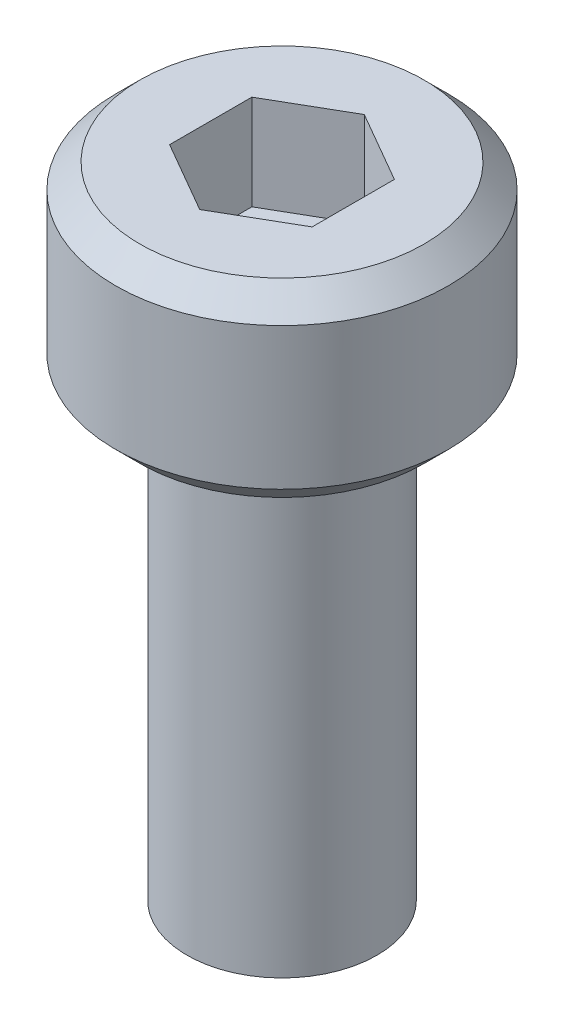
ISO-10303-21;
HEADER;
FILE_DESCRIPTION(('STEP AP214'),'2;1');
FILE_NAME('part.step','',(''),(''),'','','');
FILE_SCHEMA(('AUTOMOTIVE_DESIGN { 1 0 10303 214 1 1 1 1 }'));
ENDSEC;
DATA;
#1=APPLICATION_CONTEXT('core data for automotive mechanical design processes');
#2=APPLICATION_PROTOCOL_DEFINITION('international standard','automotive_design',2000,#1);
#3=PRODUCT_CONTEXT('',#1,'mechanical');
#4=PRODUCT('Part','Part','',(#3));
#5=PRODUCT_RELATED_PRODUCT_CATEGORY('part','',(#4));
#6=PRODUCT_DEFINITION_FORMATION('','',#4);
#7=PRODUCT_DEFINITION_CONTEXT('part definition',#1,'design');
#8=PRODUCT_DEFINITION('design','',#6,#7);
#9=PRODUCT_DEFINITION_SHAPE('','',#8);
#10=(LENGTH_UNIT() NAMED_UNIT(*) SI_UNIT(.MILLI.,.METRE.));
#11=(NAMED_UNIT(*) PLANE_ANGLE_UNIT() SI_UNIT($,.RADIAN.));
#12=(NAMED_UNIT(*) SI_UNIT($,.STERADIAN.) SOLID_ANGLE_UNIT());
#13=UNCERTAINTY_MEASURE_WITH_UNIT(LENGTH_MEASURE(1.E-05),#10,'distance_accuracy_value','');
#14=(GEOMETRIC_REPRESENTATION_CONTEXT(3) GLOBAL_UNCERTAINTY_ASSIGNED_CONTEXT((#13)) GLOBAL_UNIT_ASSIGNED_CONTEXT((#10,
#11,#12)) REPRESENTATION_CONTEXT('',''));
#15=CARTESIAN_POINT('',(0.,0.,0.));
#16=DIRECTION('',(0.,0.,1.));
#17=DIRECTION('',(1.,0.,0.));
#18=AXIS2_PLACEMENT_3D('',#15,#16,#17);
#19=CARTESIAN_POINT('',(0.,3.99999199999999,0.));
#20=DIRECTION('',(0.,-1.,0.));
#21=DIRECTION('',(1.,0.,0.));
#22=AXIS2_PLACEMENT_3D('',#19,#20,#21);
#23=CYLINDRICAL_SURFACE('',#22,3.5);
#24=CARTESIAN_POINT('',(0.,3.49199200006044,0.));
#25=DIRECTION('',(0.,1.,0.));
#26=DIRECTION('',(-1.,0.,0.));
#27=AXIS2_PLACEMENT_3D('',#24,#25,#26);
#28=CIRCLE('',#27,3.5);
#29=CARTESIAN_POINT('',(-3.5,3.49199200006044,0.));
#30=VERTEX_POINT('',#29);
#31=EDGE_CURVE('E154',#30,#30,#28,.F.);
#32=ORIENTED_EDGE('',*,*,#31,.T.);
#33=EDGE_LOOP('',(#32));
#34=FACE_BOUND('',#33,.T.);
#35=CARTESIAN_POINT('',(0.,0.507999999996399,0.));
#36=DIRECTION('',(0.,-1.,0.));
#37=DIRECTION('',(1.,0.,0.));
#38=AXIS2_PLACEMENT_3D('',#35,#36,#37);
#39=CIRCLE('',#38,3.5);
#40=CARTESIAN_POINT('',(3.5,0.507999999996399,0.));
#41=VERTEX_POINT('',#40);
#42=EDGE_CURVE('E151',#41,#41,#39,.F.);
#43=ORIENTED_EDGE('',*,*,#42,.T.);
#44=EDGE_LOOP('',(#43));
#45=FACE_BOUND('',#44,.T.);
#46=ADVANCED_FACE('F40',(#34,#45),#23,.T.);
#47=CARTESIAN_POINT('',(3.5,3.99999199999999,0.));
#48=DIRECTION('',(0.,1.,0.));
#49=DIRECTION('',(-1.,0.,0.));
#50=AXIS2_PLACEMENT_3D('',#47,#48,#49);
#51=PLANE('',#50);
#52=CARTESIAN_POINT('',(0.,3.99999199999999,0.));
#53=DIRECTION('',(0.,1.,0.));
#54=DIRECTION('',(-1.,0.,0.));
#55=AXIS2_PLACEMENT_3D('',#52,#53,#54);
#56=CIRCLE('',#55,2.9920000000036);
#57=CARTESIAN_POINT('',(-2.9920000000036,3.99999199999999,0.));
#58=VERTEX_POINT('',#57);
#59=EDGE_CURVE('E157',#58,#58,#56,.T.);
#60=ORIENTED_EDGE('',*,*,#59,.T.);
#61=EDGE_LOOP('',(#60));
#62=FACE_BOUND('',#61,.T.);
#63=DIRECTION('',(0.,0.,-1.));
#64=VECTOR('',#63,1.);
#65=CARTESIAN_POINT('',(1.5,3.99999199999999,0.866025403784437));
#66=LINE('',#65,#64);
#67=CARTESIAN_POINT('',(1.5,3.99999199999999,0.866025403784437));
#68=VERTEX_POINT('',#67);
#69=CARTESIAN_POINT('',(1.5,3.99999199999999,-0.866025403784425));
#70=VERTEX_POINT('',#69);
#71=EDGE_CURVE('E56',#68,#70,#66,.T.);
#72=ORIENTED_EDGE('',*,*,#71,.F.);
#73=DIRECTION('',(0.866025403784439,0.,-0.5));
#74=VECTOR('',#73,1.);
#75=CARTESIAN_POINT('',(0.,3.99999199999999,1.73205080756888));
#76=LINE('',#75,#74);
#77=CARTESIAN_POINT('',(0.,3.99999199999999,1.73205080756888));
#78=VERTEX_POINT('',#77);
#79=EDGE_CURVE('E139',#78,#68,#76,.T.);
#80=ORIENTED_EDGE('',*,*,#79,.F.);
#81=DIRECTION('',(0.866025403784439,0.,0.499999999999999));
#82=VECTOR('',#81,1.);
#83=CARTESIAN_POINT('',(-1.49999999999999,3.99999199999999,0.866025403784443));
#84=LINE('',#83,#82);
#85=CARTESIAN_POINT('',(-1.49999999999999,3.99999199999999,0.866025403784443));
#86=VERTEX_POINT('',#85);
#87=EDGE_CURVE('E137',#86,#78,#84,.T.);
#88=ORIENTED_EDGE('',*,*,#87,.F.);
#89=DIRECTION('',(0.,0.,1.));
#90=VECTOR('',#89,1.);
#91=CARTESIAN_POINT('',(-1.49999999999999,3.99999199999999,-0.866025403784429));
#92=LINE('',#91,#90);
#93=CARTESIAN_POINT('',(-1.49999999999999,3.99999199999999,-0.866025403784429));
#94=VERTEX_POINT('',#93);
#95=EDGE_CURVE('E104',#94,#86,#92,.T.);
#96=ORIENTED_EDGE('',*,*,#95,.F.);
#97=DIRECTION('',(-0.866025403784439,0.,0.499999999999999));
#98=VECTOR('',#97,1.);
#99=CARTESIAN_POINT('',(0.,3.99999199999999,-1.73205080756887));
#100=LINE('',#99,#98);
#101=CARTESIAN_POINT('',(0.,3.99999199999999,-1.73205080756887));
#102=VERTEX_POINT('',#101);
#103=EDGE_CURVE('E133',#102,#94,#100,.T.);
#104=ORIENTED_EDGE('',*,*,#103,.F.);
#105=DIRECTION('',(-0.866025403784437,0.,-0.500000000000003));
#106=VECTOR('',#105,1.);
#107=CARTESIAN_POINT('',(1.5,3.99999199999999,-0.866025403784425));
#108=LINE('',#107,#106);
#109=EDGE_CURVE('E130',#70,#102,#108,.T.);
#110=ORIENTED_EDGE('',*,*,#109,.F.);
#111=EDGE_LOOP('',(#72,#80,#88,#96,#104,#110));
#112=FACE_BOUND('',#111,.T.);
#113=ADVANCED_FACE('F177',(#62,#112),#51,.T.);
#114=CARTESIAN_POINT('',(0.,0.,0.));
#115=DIRECTION('',(0.,-1.,0.));
#116=DIRECTION('',(1.,0.,0.));
#117=AXIS2_PLACEMENT_3D('',#114,#115,#116);
#118=PLANE('',#117);
#119=CARTESIAN_POINT('',(0.,0.,0.));
#120=DIRECTION('',(0.,-1.,0.));
#121=DIRECTION('',(1.,0.,0.));
#122=AXIS2_PLACEMENT_3D('',#119,#120,#121);
#123=CIRCLE('',#122,2.99200000006045);
#124=CARTESIAN_POINT('',(2.99200000006045,0.,0.));
#125=VERTEX_POINT('',#124);
#126=EDGE_CURVE('E160',#125,#125,#123,.T.);
#127=ORIENTED_EDGE('',*,*,#126,.T.);
#128=EDGE_LOOP('',(#127));
#129=FACE_BOUND('',#128,.T.);
#130=CARTESIAN_POINT('',(0.,0.,0.));
#131=DIRECTION('',(0.,-1.,0.));
#132=DIRECTION('',(1.,0.,0.));
#133=AXIS2_PLACEMENT_3D('',#130,#131,#132);
#134=CIRCLE('',#133,2.);
#135=CARTESIAN_POINT('',(2.00000000000001,0.,0.));
#136=VERTEX_POINT('',#135);
#137=EDGE_CURVE('E143',#136,#136,#134,.T.);
#138=ORIENTED_EDGE('',*,*,#137,.F.);
#139=EDGE_LOOP('',(#138));
#140=FACE_BOUND('',#139,.T.);
#141=ADVANCED_FACE('F183',(#129,#140),#118,.T.);
#142=CARTESIAN_POINT('',(0.,-10.,0.));
#143=DIRECTION('',(0.,1.,0.));
#144=DIRECTION('',(-1.,0.,0.));
#145=AXIS2_PLACEMENT_3D('',#142,#143,#144);
#146=CYLINDRICAL_SURFACE('',#145,2.);
#147=CARTESIAN_POINT('',(0.,-9.46151999994454,0.));
#148=DIRECTION('',(0.,-1.,0.));
#149=DIRECTION('',(0.,0.,-1.));
#150=AXIS2_PLACEMENT_3D('',#147,#148,#149);
#151=CIRCLE('',#150,2.);
#152=CARTESIAN_POINT('',(0.,-9.46151999994454,-2.00000000000001));
#153=VERTEX_POINT('',#152);
#154=EDGE_CURVE('E11',#153,#153,#151,.F.);
#155=ORIENTED_EDGE('',*,*,#154,.T.);
#156=EDGE_LOOP('',(#155));
#157=FACE_BOUND('',#156,.T.);
#158=ORIENTED_EDGE('',*,*,#137,.T.);
#159=EDGE_LOOP('',(#158));
#160=FACE_BOUND('',#159,.T.);
#161=ADVANCED_FACE('F222',(#157,#160),#146,.T.);
#162=CARTESIAN_POINT('',(0.,-10.,0.));
#163=DIRECTION('',(0.,-1.,0.));
#164=DIRECTION('',(1.,0.,0.));
#165=AXIS2_PLACEMENT_3D('',#162,#163,#164);
#166=PLANE('',#165);
#167=CARTESIAN_POINT('',(0.,-10.,0.));
#168=DIRECTION('',(0.,-1.,0.));
#169=DIRECTION('',(1.,0.,0.));
#170=AXIS2_PLACEMENT_3D('',#167,#168,#169);
#171=CIRCLE('',#170,1.23038000001456);
#172=CARTESIAN_POINT('',(1.23038000001456,-10.,0.));
#173=VERTEX_POINT('',#172);
#174=EDGE_CURVE('E49',#173,#173,#171,.T.);
#175=ORIENTED_EDGE('',*,*,#174,.T.);
#176=EDGE_LOOP('',(#175));
#177=FACE_BOUND('',#176,.T.);
#178=ADVANCED_FACE('F165',(#177),#166,.T.);
#179=CARTESIAN_POINT('',(1.5,1.99999199999999,0.866025403784437));
#180=DIRECTION('',(1.,0.,0.));
#181=DIRECTION('',(0.,0.,-1.));
#182=AXIS2_PLACEMENT_3D('',#179,#180,#181);
#183=PLANE('',#182);
#184=ORIENTED_EDGE('',*,*,#71,.T.);
#185=DIRECTION('',(0.,1.,0.));
#186=VECTOR('',#185,1.);
#187=CARTESIAN_POINT('',(1.5,1.99999199999999,-0.866025403784425));
#188=LINE('',#187,#186);
#189=CARTESIAN_POINT('',(1.5,1.99999199999999,-0.866025403784425));
#190=VERTEX_POINT('',#189);
#191=EDGE_CURVE('E86',#190,#70,#188,.T.);
#192=ORIENTED_EDGE('',*,*,#191,.F.);
#193=DIRECTION('',(0.,0.,-1.));
#194=VECTOR('',#193,1.);
#195=CARTESIAN_POINT('',(1.5,1.99999199999999,0.866025403784437));
#196=LINE('',#195,#194);
#197=CARTESIAN_POINT('',(1.5,1.99999199999999,0.866025403784437));
#198=VERTEX_POINT('',#197);
#199=EDGE_CURVE('E141',#198,#190,#196,.T.);
#200=ORIENTED_EDGE('',*,*,#199,.F.);
#201=DIRECTION('',(0.,1.,0.));
#202=VECTOR('',#201,1.);
#203=CARTESIAN_POINT('',(1.5,1.99999199999999,0.866025403784437));
#204=LINE('',#203,#202);
#205=EDGE_CURVE('E64',#198,#68,#204,.T.);
#206=ORIENTED_EDGE('',*,*,#205,.T.);
#207=EDGE_LOOP('',(#184,#192,#200,#206));
#208=FACE_BOUND('',#207,.T.);
#209=ADVANCED_FACE('F213',(#208),#183,.F.);
#210=CARTESIAN_POINT('',(0.,1.99999199999999,1.73205080756888));
#211=DIRECTION('',(0.5,0.,0.866025403784439));
#212=DIRECTION('',(0.866025403784439,0.,-0.5));
#213=AXIS2_PLACEMENT_3D('',#210,#211,#212);
#214=PLANE('',#213);
#215=ORIENTED_EDGE('',*,*,#79,.T.);
#216=ORIENTED_EDGE('',*,*,#205,.F.);
#217=DIRECTION('',(0.866025403784439,0.,-0.5));
#218=VECTOR('',#217,1.);
#219=CARTESIAN_POINT('',(0.,1.99999199999999,1.73205080756888));
#220=LINE('',#219,#218);
#221=CARTESIAN_POINT('',(0.,1.99999199999999,1.73205080756888));
#222=VERTEX_POINT('',#221);
#223=EDGE_CURVE('E116',#222,#198,#220,.T.);
#224=ORIENTED_EDGE('',*,*,#223,.F.);
#225=DIRECTION('',(0.,1.,0.));
#226=VECTOR('',#225,1.);
#227=CARTESIAN_POINT('',(0.,1.99999199999999,1.73205080756888));
#228=LINE('',#227,#226);
#229=EDGE_CURVE('E108',#222,#78,#228,.T.);
#230=ORIENTED_EDGE('',*,*,#229,.T.);
#231=EDGE_LOOP('',(#215,#216,#224,#230));
#232=FACE_BOUND('',#231,.T.);
#233=ADVANCED_FACE('F215',(#232),#214,.F.);
#234=CARTESIAN_POINT('',(-1.49999999999999,1.99999199999999,0.866025403784443));
#235=DIRECTION('',(-0.499999999999999,0.,0.866025403784439));
#236=DIRECTION('',(0.866025403784439,0.,0.499999999999999));
#237=AXIS2_PLACEMENT_3D('',#234,#235,#236);
#238=PLANE('',#237);
#239=ORIENTED_EDGE('',*,*,#87,.T.);
#240=ORIENTED_EDGE('',*,*,#229,.F.);
#241=DIRECTION('',(0.866025403784439,0.,0.499999999999999));
#242=VECTOR('',#241,1.);
#243=CARTESIAN_POINT('',(-1.49999999999999,1.99999199999999,0.866025403784443));
#244=LINE('',#243,#242);
#245=CARTESIAN_POINT('',(-1.49999999999999,1.99999199999999,0.866025403784443));
#246=VERTEX_POINT('',#245);
#247=EDGE_CURVE('E112',#246,#222,#244,.T.);
#248=ORIENTED_EDGE('',*,*,#247,.F.);
#249=DIRECTION('',(0.,1.,0.));
#250=VECTOR('',#249,1.);
#251=CARTESIAN_POINT('',(-1.49999999999999,1.99999199999999,0.866025403784443));
#252=LINE('',#251,#250);
#253=EDGE_CURVE('E97',#246,#86,#252,.T.);
#254=ORIENTED_EDGE('',*,*,#253,.T.);
#255=EDGE_LOOP('',(#239,#240,#248,#254));
#256=FACE_BOUND('',#255,.T.);
#257=ADVANCED_FACE('F113',(#256),#238,.F.);
#258=CARTESIAN_POINT('',(-1.49999999999999,1.99999199999999,-0.866025403784429));
#259=DIRECTION('',(-1.,0.,0.));
#260=DIRECTION('',(0.,0.,1.));
#261=AXIS2_PLACEMENT_3D('',#258,#259,#260);
#262=PLANE('',#261);
#263=ORIENTED_EDGE('',*,*,#95,.T.);
#264=ORIENTED_EDGE('',*,*,#253,.F.);
#265=DIRECTION('',(0.,0.,1.));
#266=VECTOR('',#265,1.);
#267=CARTESIAN_POINT('',(-1.49999999999999,1.99999199999999,-0.866025403784429));
#268=LINE('',#267,#266);
#269=CARTESIAN_POINT('',(-1.49999999999999,1.99999199999999,-0.866025403784429));
#270=VERTEX_POINT('',#269);
#271=EDGE_CURVE('E101',#270,#246,#268,.T.);
#272=ORIENTED_EDGE('',*,*,#271,.F.);
#273=DIRECTION('',(0.,1.,0.));
#274=VECTOR('',#273,1.);
#275=CARTESIAN_POINT('',(-1.49999999999999,1.99999199999999,-0.866025403784429));
#276=LINE('',#275,#274);
#277=EDGE_CURVE('E109',#270,#94,#276,.T.);
#278=ORIENTED_EDGE('',*,*,#277,.T.);
#279=EDGE_LOOP('',(#263,#264,#272,#278));
#280=FACE_BOUND('',#279,.T.);
#281=ADVANCED_FACE('F99',(#280),#262,.F.);
#282=CARTESIAN_POINT('',(0.,1.99999199999999,-1.73205080756887));
#283=DIRECTION('',(-0.499999999999999,0.,-0.866025403784439));
#284=DIRECTION('',(-0.866025403784439,0.,0.499999999999999));
#285=AXIS2_PLACEMENT_3D('',#282,#283,#284);
#286=PLANE('',#285);
#287=ORIENTED_EDGE('',*,*,#103,.T.);
#288=ORIENTED_EDGE('',*,*,#277,.F.);
#289=DIRECTION('',(-0.866025403784439,0.,0.499999999999999));
#290=VECTOR('',#289,1.);
#291=CARTESIAN_POINT('',(0.,1.99999199999999,-1.73205080756887));
#292=LINE('',#291,#290);
#293=CARTESIAN_POINT('',(0.,1.99999199999999,-1.73205080756887));
#294=VERTEX_POINT('',#293);
#295=EDGE_CURVE('E122',#294,#270,#292,.T.);
#296=ORIENTED_EDGE('',*,*,#295,.F.);
#297=DIRECTION('',(0.,1.,0.));
#298=VECTOR('',#297,1.);
#299=CARTESIAN_POINT('',(0.,1.99999199999999,-1.73205080756887));
#300=LINE('',#299,#298);
#301=EDGE_CURVE('E146',#294,#102,#300,.T.);
#302=ORIENTED_EDGE('',*,*,#301,.T.);
#303=EDGE_LOOP('',(#287,#288,#296,#302));
#304=FACE_BOUND('',#303,.T.);
#305=ADVANCED_FACE('F277',(#304),#286,.F.);
#306=CARTESIAN_POINT('',(1.5,1.99999199999999,-0.866025403784425));
#307=DIRECTION('',(0.500000000000003,0.,-0.866025403784437));
#308=DIRECTION('',(-0.866025403784437,0.,-0.500000000000003));
#309=AXIS2_PLACEMENT_3D('',#306,#307,#308);
#310=PLANE('',#309);
#311=ORIENTED_EDGE('',*,*,#109,.T.);
#312=ORIENTED_EDGE('',*,*,#301,.F.);
#313=DIRECTION('',(-0.866025403784437,0.,-0.500000000000003));
#314=VECTOR('',#313,1.);
#315=CARTESIAN_POINT('',(1.5,1.99999199999999,-0.866025403784425));
#316=LINE('',#315,#314);
#317=EDGE_CURVE('E124',#190,#294,#316,.T.);
#318=ORIENTED_EDGE('',*,*,#317,.F.);
#319=ORIENTED_EDGE('',*,*,#191,.T.);
#320=EDGE_LOOP('',(#311,#312,#318,#319));
#321=FACE_BOUND('',#320,.T.);
#322=ADVANCED_FACE('F202',(#321),#310,.F.);
#323=CARTESIAN_POINT('',(0.,1.99999199999999,0.));
#324=DIRECTION('',(0.,1.,0.));
#325=DIRECTION('',(0.,0.,1.));
#326=AXIS2_PLACEMENT_3D('',#323,#324,#325);
#327=PLANE('',#326);
#328=ORIENTED_EDGE('',*,*,#199,.T.);
#329=ORIENTED_EDGE('',*,*,#317,.T.);
#330=ORIENTED_EDGE('',*,*,#295,.T.);
#331=ORIENTED_EDGE('',*,*,#271,.T.);
#332=ORIENTED_EDGE('',*,*,#247,.T.);
#333=ORIENTED_EDGE('',*,*,#223,.T.);
#334=EDGE_LOOP('',(#328,#329,#330,#331,#332,#333));
#335=FACE_BOUND('',#334,.T.);
#336=ADVANCED_FACE('F119',(#335),#327,.T.);
#337=CARTESIAN_POINT('',(0.,3.49199200006044,0.));
#338=DIRECTION('',(0.,-1.,0.));
#339=DIRECTION('',(1.,0.,0.));
#340=AXIS2_PLACEMENT_3D('',#337,#338,#339);
#341=CONICAL_SURFACE('',#340,3.5,0.785398163453399);
#342=ORIENTED_EDGE('',*,*,#59,.F.);
#343=EDGE_LOOP('',(#342));
#344=FACE_BOUND('',#343,.T.);
#345=ORIENTED_EDGE('',*,*,#31,.F.);
#346=EDGE_LOOP('',(#345));
#347=FACE_BOUND('',#346,.T.);
#348=ADVANCED_FACE('F173',(#344,#347),#341,.T.);
#349=CARTESIAN_POINT('',(0.,0.,0.));
#350=DIRECTION('',(0.,1.,0.));
#351=DIRECTION('',(-1.,0.,0.));
#352=AXIS2_PLACEMENT_3D('',#349,#350,#351);
#353=CONICAL_SURFACE('',#352,2.99200000006045,0.785398163341496);
#354=ORIENTED_EDGE('',*,*,#42,.F.);
#355=EDGE_LOOP('',(#354));
#356=FACE_BOUND('',#355,.T.);
#357=ORIENTED_EDGE('',*,*,#126,.F.);
#358=EDGE_LOOP('',(#357));
#359=FACE_BOUND('',#358,.T.);
#360=ADVANCED_FACE('F168',(#356,#359),#353,.T.);
#361=CARTESIAN_POINT('',(0.,-10.,0.));
#362=DIRECTION('',(0.,1.,0.));
#363=DIRECTION('',(0.,0.,1.));
#364=AXIS2_PLACEMENT_3D('',#361,#362,#363);
#365=CONICAL_SURFACE('',#364,1.23038000001456,0.960291895353212);
#366=ORIENTED_EDGE('',*,*,#154,.F.);
#367=EDGE_LOOP('',(#366));
#368=FACE_BOUND('',#367,.T.);
#369=ORIENTED_EDGE('',*,*,#174,.F.);
#370=EDGE_LOOP('',(#369));
#371=FACE_BOUND('',#370,.T.);
#372=ADVANCED_FACE('F43',(#368,#371),#365,.T.);
#373=CLOSED_SHELL('',(#46,#113,#141,#161,#178,#209,#233,#257,#281,#305,#322,#336,#348,#360,#372));
#374=MANIFOLD_SOLID_BREP('B2',#373);
#375=ADVANCED_BREP_SHAPE_REPRESENTATION('',(#18,#374),#14);
#376=SHAPE_DEFINITION_REPRESENTATION(#9,#375);
ENDSEC;
END-ISO-10303-21;
